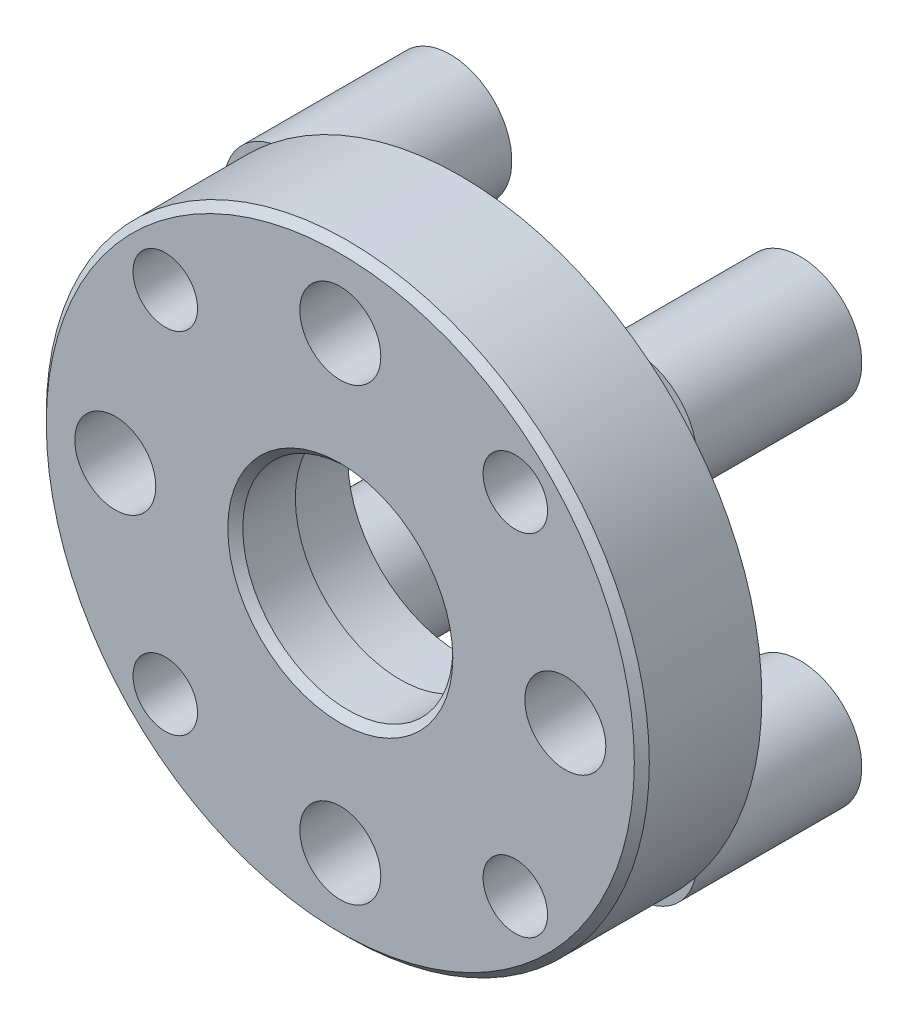
ISO-10303-21;
HEADER;
FILE_DESCRIPTION(('STEP AP214'),'2;1');
FILE_NAME('part.step','',(''),(''),'','','');
FILE_SCHEMA(('AUTOMOTIVE_DESIGN { 1 0 10303 214 1 1 1 1 }'));
ENDSEC;
DATA;
#1=APPLICATION_CONTEXT('core data for automotive mechanical design processes');
#2=APPLICATION_PROTOCOL_DEFINITION('international standard','automotive_design',2000,#1);
#3=PRODUCT_CONTEXT('',#1,'mechanical');
#4=PRODUCT('Part','Part','',(#3));
#5=PRODUCT_RELATED_PRODUCT_CATEGORY('part','',(#4));
#6=PRODUCT_DEFINITION_FORMATION('','',#4);
#7=PRODUCT_DEFINITION_CONTEXT('part definition',#1,'design');
#8=PRODUCT_DEFINITION('design','',#6,#7);
#9=PRODUCT_DEFINITION_SHAPE('','',#8);
#10=(LENGTH_UNIT() NAMED_UNIT(*) SI_UNIT(.MILLI.,.METRE.));
#11=(NAMED_UNIT(*) PLANE_ANGLE_UNIT() SI_UNIT($,.RADIAN.));
#12=(NAMED_UNIT(*) SI_UNIT($,.STERADIAN.) SOLID_ANGLE_UNIT());
#13=UNCERTAINTY_MEASURE_WITH_UNIT(LENGTH_MEASURE(1.E-05),#10,'distance_accuracy_value','');
#14=(GEOMETRIC_REPRESENTATION_CONTEXT(3) GLOBAL_UNCERTAINTY_ASSIGNED_CONTEXT((#13)) GLOBAL_UNIT_ASSIGNED_CONTEXT((#10,
#11,#12)) REPRESENTATION_CONTEXT('',''));
#15=CARTESIAN_POINT('',(0.,0.,0.));
#16=DIRECTION('',(0.,0.,1.));
#17=DIRECTION('',(1.,0.,0.));
#18=AXIS2_PLACEMENT_3D('',#15,#16,#17);
#19=CARTESIAN_POINT('',(0.,0.,33.2347367900408));
#20=DIRECTION('',(0.,0.,-1.));
#21=DIRECTION('',(-1.,0.,0.));
#22=AXIS2_PLACEMENT_3D('',#19,#20,#21);
#23=CYLINDRICAL_SURFACE('',#22,7.5);
#24=CARTESIAN_POINT('',(0.,0.,25.2347367900408));
#25=DIRECTION('',(0.,0.,1.));
#26=DIRECTION('',(1.,0.,0.));
#27=AXIS2_PLACEMENT_3D('',#24,#25,#26);
#28=CIRCLE('',#27,7.5);
#29=CARTESIAN_POINT('',(7.5,0.,25.2347367900408));
#30=VERTEX_POINT('',#29);
#31=EDGE_CURVE('E134',#30,#30,#28,.T.);
#32=ORIENTED_EDGE('',*,*,#31,.F.);
#33=EDGE_LOOP('',(#32));
#34=FACE_BOUND('',#33,.T.);
#35=CARTESIAN_POINT('',(0.,0.,29.2347367900408));
#36=DIRECTION('',(0.,0.,1.));
#37=DIRECTION('',(1.,0.,0.));
#38=AXIS2_PLACEMENT_3D('',#35,#36,#37);
#39=CIRCLE('',#38,7.5);
#40=CARTESIAN_POINT('',(7.5,0.,29.2347367900408));
#41=VERTEX_POINT('',#40);
#42=EDGE_CURVE('E346',#41,#41,#39,.T.);
#43=ORIENTED_EDGE('',*,*,#42,.T.);
#44=EDGE_LOOP('',(#43));
#45=FACE_BOUND('',#44,.T.);
#46=ADVANCED_FACE('F60',(#34,#45),#23,.F.);
#47=CARTESIAN_POINT('',(11.667261889578,-11.667261889578,14.2347367900408));
#48=DIRECTION('',(0.,0.,1.));
#49=DIRECTION('',(1.,0.,0.));
#50=AXIS2_PLACEMENT_3D('',#47,#48,#49);
#51=CYLINDRICAL_SURFACE('',#50,1.6);
#52=CARTESIAN_POINT('',(11.667261889578,-11.667261889578,17.2347367900408));
#53=DIRECTION('',(0.,0.,-1.));
#54=DIRECTION('',(-1.,0.,0.));
#55=AXIS2_PLACEMENT_3D('',#52,#53,#54);
#56=CIRCLE('',#55,1.6);
#57=CARTESIAN_POINT('',(10.067261889578,-11.667261889578,17.2347367900408));
#58=VERTEX_POINT('',#57);
#59=EDGE_CURVE('E137',#58,#58,#56,.F.);
#60=ORIENTED_EDGE('',*,*,#59,.F.);
#61=EDGE_LOOP('',(#60));
#62=FACE_BOUND('',#61,.T.);
#63=CARTESIAN_POINT('',(11.667261889578,-11.667261889578,25.2347367900408));
#64=DIRECTION('',(0.,0.,1.));
#65=DIRECTION('',(1.,0.,0.));
#66=AXIS2_PLACEMENT_3D('',#63,#64,#65);
#67=CIRCLE('',#66,1.6);
#68=CARTESIAN_POINT('',(13.267261889578,-11.667261889578,25.2347367900408));
#69=VERTEX_POINT('',#68);
#70=EDGE_CURVE('E119',#69,#69,#67,.F.);
#71=ORIENTED_EDGE('',*,*,#70,.F.);
#72=EDGE_LOOP('',(#71));
#73=FACE_BOUND('',#72,.T.);
#74=ADVANCED_FACE('F227',(#62,#73),#51,.F.);
#75=CARTESIAN_POINT('',(-11.667261889578,-11.667261889578,14.2347367900408));
#76=DIRECTION('',(0.,0.,1.));
#77=DIRECTION('',(1.,0.,0.));
#78=AXIS2_PLACEMENT_3D('',#75,#76,#77);
#79=CYLINDRICAL_SURFACE('',#78,1.6);
#80=CARTESIAN_POINT('',(-11.667261889578,-11.667261889578,17.2347367900408));
#81=DIRECTION('',(0.,0.,-1.));
#82=DIRECTION('',(-1.,0.,0.));
#83=AXIS2_PLACEMENT_3D('',#80,#81,#82);
#84=CIRCLE('',#83,1.6);
#85=CARTESIAN_POINT('',(-13.267261889578,-11.667261889578,17.2347367900408));
#86=VERTEX_POINT('',#85);
#87=EDGE_CURVE('E481',#86,#86,#84,.F.);
#88=ORIENTED_EDGE('',*,*,#87,.F.);
#89=EDGE_LOOP('',(#88));
#90=FACE_BOUND('',#89,.T.);
#91=CARTESIAN_POINT('',(-11.667261889578,-11.667261889578,25.2347367900408));
#92=DIRECTION('',(0.,0.,1.));
#93=DIRECTION('',(1.,0.,0.));
#94=AXIS2_PLACEMENT_3D('',#91,#92,#93);
#95=CIRCLE('',#94,1.6);
#96=CARTESIAN_POINT('',(-10.067261889578,-11.667261889578,25.2347367900408));
#97=VERTEX_POINT('',#96);
#98=EDGE_CURVE('E468',#97,#97,#95,.F.);
#99=ORIENTED_EDGE('',*,*,#98,.F.);
#100=EDGE_LOOP('',(#99));
#101=FACE_BOUND('',#100,.T.);
#102=ADVANCED_FACE('F235',(#90,#101),#79,.F.);
#103=CARTESIAN_POINT('',(-11.667261889578,11.667261889578,14.2347367900408));
#104=DIRECTION('',(0.,0.,1.));
#105=DIRECTION('',(1.,0.,0.));
#106=AXIS2_PLACEMENT_3D('',#103,#104,#105);
#107=CYLINDRICAL_SURFACE('',#106,1.6);
#108=CARTESIAN_POINT('',(-11.667261889578,11.667261889578,17.2347367900408));
#109=DIRECTION('',(0.,0.,-1.));
#110=DIRECTION('',(-1.,0.,0.));
#111=AXIS2_PLACEMENT_3D('',#108,#109,#110);
#112=CIRCLE('',#111,1.6);
#113=CARTESIAN_POINT('',(-13.267261889578,11.667261889578,17.2347367900408));
#114=VERTEX_POINT('',#113);
#115=EDGE_CURVE('E484',#114,#114,#112,.F.);
#116=ORIENTED_EDGE('',*,*,#115,.F.);
#117=EDGE_LOOP('',(#116));
#118=FACE_BOUND('',#117,.T.);
#119=CARTESIAN_POINT('',(-11.667261889578,11.667261889578,25.2347367900408));
#120=DIRECTION('',(0.,0.,1.));
#121=DIRECTION('',(1.,0.,0.));
#122=AXIS2_PLACEMENT_3D('',#119,#120,#121);
#123=CIRCLE('',#122,1.6);
#124=CARTESIAN_POINT('',(-10.067261889578,11.667261889578,25.2347367900408));
#125=VERTEX_POINT('',#124);
#126=EDGE_CURVE('E465',#125,#125,#123,.F.);
#127=ORIENTED_EDGE('',*,*,#126,.F.);
#128=EDGE_LOOP('',(#127));
#129=FACE_BOUND('',#128,.T.);
#130=ADVANCED_FACE('F451',(#118,#129),#107,.F.);
#131=CARTESIAN_POINT('',(11.667261889578,11.667261889578,14.2347367900408));
#132=DIRECTION('',(0.,0.,1.));
#133=DIRECTION('',(1.,0.,0.));
#134=AXIS2_PLACEMENT_3D('',#131,#132,#133);
#135=CYLINDRICAL_SURFACE('',#134,1.6);
#136=CARTESIAN_POINT('',(11.667261889578,11.667261889578,17.2347367900408));
#137=DIRECTION('',(0.,0.,-1.));
#138=DIRECTION('',(-1.,0.,0.));
#139=AXIS2_PLACEMENT_3D('',#136,#137,#138);
#140=CIRCLE('',#139,1.6);
#141=CARTESIAN_POINT('',(10.067261889578,11.667261889578,17.2347367900408));
#142=VERTEX_POINT('',#141);
#143=EDGE_CURVE('E185',#142,#142,#140,.F.);
#144=ORIENTED_EDGE('',*,*,#143,.F.);
#145=EDGE_LOOP('',(#144));
#146=FACE_BOUND('',#145,.T.);
#147=CARTESIAN_POINT('',(11.667261889578,11.667261889578,25.2347367900408));
#148=DIRECTION('',(0.,0.,1.));
#149=DIRECTION('',(1.,0.,0.));
#150=AXIS2_PLACEMENT_3D('',#147,#148,#149);
#151=CIRCLE('',#150,1.6);
#152=CARTESIAN_POINT('',(13.267261889578,11.667261889578,25.2347367900408));
#153=VERTEX_POINT('',#152);
#154=EDGE_CURVE('E317',#153,#153,#151,.F.);
#155=ORIENTED_EDGE('',*,*,#154,.F.);
#156=EDGE_LOOP('',(#155));
#157=FACE_BOUND('',#156,.T.);
#158=ADVANCED_FACE('F194',(#146,#157),#135,.F.);
#159=CARTESIAN_POINT('',(11.667261889578,11.667261889578,14.2347367900408));
#160=DIRECTION('',(0.,0.,-1.));
#161=DIRECTION('',(-1.,0.,0.));
#162=AXIS2_PLACEMENT_3D('',#159,#160,#161);
#163=PLANE('',#162);
#164=CARTESIAN_POINT('',(11.667261889578,11.667261889578,14.2347367900408));
#165=DIRECTION('',(0.,0.,-1.));
#166=DIRECTION('',(-1.,0.,0.));
#167=AXIS2_PLACEMENT_3D('',#164,#165,#166);
#168=CIRCLE('',#167,3.);
#169=CARTESIAN_POINT('',(8.66726188957803,11.667261889578,14.2347367900408));
#170=VERTEX_POINT('',#169);
#171=EDGE_CURVE('E167',#170,#170,#168,.T.);
#172=ORIENTED_EDGE('',*,*,#171,.F.);
#173=EDGE_LOOP('',(#172));
#174=FACE_BOUND('',#173,.T.);
#175=CARTESIAN_POINT('',(11.667261889578,11.667261889578,14.2347367900408));
#176=DIRECTION('',(0.,0.,-1.));
#177=DIRECTION('',(-1.,0.,0.));
#178=AXIS2_PLACEMENT_3D('',#175,#176,#177);
#179=CIRCLE('',#178,4.1);
#180=CARTESIAN_POINT('',(7.56726188957803,11.667261889578,14.2347367900408));
#181=VERTEX_POINT('',#180);
#182=EDGE_CURVE('E122',#181,#181,#179,.T.);
#183=ORIENTED_EDGE('',*,*,#182,.T.);
#184=EDGE_LOOP('',(#183));
#185=FACE_BOUND('',#184,.T.);
#186=ADVANCED_FACE('F191',(#174,#185),#163,.T.);
#187=CARTESIAN_POINT('',(11.667261889578,11.667261889578,25.2347367900408));
#188=DIRECTION('',(0.,0.,-1.));
#189=DIRECTION('',(-1.,0.,0.));
#190=AXIS2_PLACEMENT_3D('',#187,#188,#189);
#191=PLANE('',#190);
#192=CARTESIAN_POINT('',(0.,0.,25.2347367900408));
#193=DIRECTION('',(0.,0.,1.));
#194=DIRECTION('',(1.,0.,0.));
#195=AXIS2_PLACEMENT_3D('',#192,#193,#194);
#196=CIRCLE('',#195,20.1);
#197=CARTESIAN_POINT('',(15.6594660866061,12.6012349348163,25.2347367900408));
#198=VERTEX_POINT('',#197);
#199=CARTESIAN_POINT('',(12.6012349348163,15.6594660866061,25.2347367900408));
#200=VERTEX_POINT('',#199);
#201=EDGE_CURVE('E99',#198,#200,#196,.T.);
#202=ORIENTED_EDGE('',*,*,#201,.F.);
#203=CARTESIAN_POINT('',(11.667261889578,11.667261889578,25.2347367900408));
#204=DIRECTION('',(0.,0.,-1.));
#205=DIRECTION('',(-1.,0.,0.));
#206=AXIS2_PLACEMENT_3D('',#203,#204,#205);
#207=CIRCLE('',#206,4.1);
#208=EDGE_CURVE('E117',#200,#198,#207,.T.);
#209=ORIENTED_EDGE('',*,*,#208,.F.);
#210=EDGE_LOOP('',(#202,#209));
#211=FACE_BOUND('',#210,.T.);
#212=ADVANCED_FACE('F121',(#211),#191,.F.);
#213=CARTESIAN_POINT('',(0.,0.,33.2347367900408));
#214=DIRECTION('',(0.,0.,1.));
#215=DIRECTION('',(1.,0.,0.));
#216=AXIS2_PLACEMENT_3D('',#213,#214,#215);
#217=PLANE('',#216);
#218=CARTESIAN_POINT('',(0.,0.,33.2347367900408));
#219=DIRECTION('',(0.,0.,1.));
#220=DIRECTION('',(1.,0.,0.));
#221=AXIS2_PLACEMENT_3D('',#218,#219,#220);
#222=CIRCLE('',#221,7.49999999999997);
#223=CARTESIAN_POINT('',(7.49999999999997,0.,33.2347367900408));
#224=VERTEX_POINT('',#223);
#225=EDGE_CURVE('E69',#224,#224,#222,.F.);
#226=ORIENTED_EDGE('',*,*,#225,.T.);
#227=EDGE_LOOP('',(#226));
#228=FACE_BOUND('',#227,.T.);
#229=CARTESIAN_POINT('',(0.,0.,33.2347367900408));
#230=DIRECTION('',(0.,0.,1.));
#231=DIRECTION('',(1.,0.,0.));
#232=AXIS2_PLACEMENT_3D('',#229,#230,#231);
#233=CIRCLE('',#232,19.6);
#234=CARTESIAN_POINT('',(19.6,0.,33.2347367900408));
#235=VERTEX_POINT('',#234);
#236=EDGE_CURVE('E275',#235,#235,#233,.T.);
#237=ORIENTED_EDGE('',*,*,#236,.T.);
#238=EDGE_LOOP('',(#237));
#239=FACE_BOUND('',#238,.T.);
#240=CARTESIAN_POINT('',(15.,0.,33.2347367900408));
#241=DIRECTION('',(0.,0.,1.));
#242=DIRECTION('',(1.,0.,0.));
#243=AXIS2_PLACEMENT_3D('',#240,#241,#242);
#244=CIRCLE('',#243,2.7);
#245=CARTESIAN_POINT('',(17.7,0.,33.2347367900408));
#246=VERTEX_POINT('',#245);
#247=EDGE_CURVE('E287',#246,#246,#244,.T.);
#248=ORIENTED_EDGE('',*,*,#247,.F.);
#249=EDGE_LOOP('',(#248));
#250=FACE_BOUND('',#249,.T.);
#251=CARTESIAN_POINT('',(-1.04744440165294E-13,-15.,33.2347367900408));
#252=DIRECTION('',(0.,0.,1.));
#253=DIRECTION('',(1.,0.,0.));
#254=AXIS2_PLACEMENT_3D('',#251,#252,#253);
#255=CIRCLE('',#254,2.7);
#256=CARTESIAN_POINT('',(2.6999999999999,-15.,33.2347367900408));
#257=VERTEX_POINT('',#256);
#258=EDGE_CURVE('E291',#257,#257,#255,.T.);
#259=ORIENTED_EDGE('',*,*,#258,.F.);
#260=EDGE_LOOP('',(#259));
#261=FACE_BOUND('',#260,.T.);
#262=CARTESIAN_POINT('',(-15.,1.57116660247941E-13,33.2347367900408));
#263=DIRECTION('',(0.,0.,1.));
#264=DIRECTION('',(1.,0.,0.));
#265=AXIS2_PLACEMENT_3D('',#262,#263,#264);
#266=CIRCLE('',#265,2.7);
#267=CARTESIAN_POINT('',(-12.3,1.57116660247941E-13,33.2347367900408));
#268=VERTEX_POINT('',#267);
#269=EDGE_CURVE('E295',#268,#268,#266,.T.);
#270=ORIENTED_EDGE('',*,*,#269,.F.);
#271=EDGE_LOOP('',(#270));
#272=FACE_BOUND('',#271,.T.);
#273=CARTESIAN_POINT('',(-11.667261889578,11.667261889578,33.2347367900408));
#274=DIRECTION('',(0.,0.,1.));
#275=DIRECTION('',(1.,0.,0.));
#276=AXIS2_PLACEMENT_3D('',#273,#274,#275);
#277=CIRCLE('',#276,2.15);
#278=CARTESIAN_POINT('',(-9.51726188957804,11.667261889578,33.2347367900408));
#279=VERTEX_POINT('',#278);
#280=EDGE_CURVE('E299',#279,#279,#277,.T.);
#281=ORIENTED_EDGE('',*,*,#280,.F.);
#282=EDGE_LOOP('',(#281));
#283=FACE_BOUND('',#282,.T.);
#284=CARTESIAN_POINT('',(11.667261889578,11.667261889578,33.2347367900408));
#285=DIRECTION('',(0.,0.,1.));
#286=DIRECTION('',(1.,0.,0.));
#287=AXIS2_PLACEMENT_3D('',#284,#285,#286);
#288=CIRCLE('',#287,2.15);
#289=CARTESIAN_POINT('',(13.817261889578,11.667261889578,33.2347367900408));
#290=VERTEX_POINT('',#289);
#291=EDGE_CURVE('E303',#290,#290,#288,.T.);
#292=ORIENTED_EDGE('',*,*,#291,.F.);
#293=EDGE_LOOP('',(#292));
#294=FACE_BOUND('',#293,.T.);
#295=CARTESIAN_POINT('',(11.667261889578,-11.667261889578,33.2347367900408));
#296=DIRECTION('',(0.,0.,1.));
#297=DIRECTION('',(1.,0.,0.));
#298=AXIS2_PLACEMENT_3D('',#295,#296,#297);
#299=CIRCLE('',#298,2.15);
#300=CARTESIAN_POINT('',(13.817261889578,-11.667261889578,33.2347367900408));
#301=VERTEX_POINT('',#300);
#302=EDGE_CURVE('E307',#301,#301,#299,.T.);
#303=ORIENTED_EDGE('',*,*,#302,.F.);
#304=EDGE_LOOP('',(#303));
#305=FACE_BOUND('',#304,.T.);
#306=CARTESIAN_POINT('',(-11.667261889578,-11.667261889578,33.2347367900408));
#307=DIRECTION('',(0.,0.,1.));
#308=DIRECTION('',(1.,0.,0.));
#309=AXIS2_PLACEMENT_3D('',#306,#307,#308);
#310=CIRCLE('',#309,2.15);
#311=CARTESIAN_POINT('',(-9.51726188957803,-11.667261889578,33.2347367900408));
#312=VERTEX_POINT('',#311);
#313=EDGE_CURVE('E311',#312,#312,#310,.T.);
#314=ORIENTED_EDGE('',*,*,#313,.F.);
#315=EDGE_LOOP('',(#314));
#316=FACE_BOUND('',#315,.T.);
#317=CARTESIAN_POINT('',(0.,15.,33.2347367900408));
#318=DIRECTION('',(0.,0.,1.));
#319=DIRECTION('',(1.,0.,0.));
#320=AXIS2_PLACEMENT_3D('',#317,#318,#319);
#321=CIRCLE('',#320,2.7);
#322=CARTESIAN_POINT('',(2.7,15.,33.2347367900408));
#323=VERTEX_POINT('',#322);
#324=EDGE_CURVE('E203',#323,#323,#321,.T.);
#325=ORIENTED_EDGE('',*,*,#324,.F.);
#326=EDGE_LOOP('',(#325));
#327=FACE_BOUND('',#326,.T.);
#328=ADVANCED_FACE('F244',(#228,#239,#250,#261,#272,#283,#294,#305,#316,#327),#217,.T.);
#329=CARTESIAN_POINT('',(0.,0.,25.2347367900408));
#330=DIRECTION('',(0.,0.,1.));
#331=DIRECTION('',(1.,0.,0.));
#332=AXIS2_PLACEMENT_3D('',#329,#330,#331);
#333=PLANE('',#332);
#334=CARTESIAN_POINT('',(15.,0.,25.2347367900408));
#335=DIRECTION('',(0.,0.,1.));
#336=DIRECTION('',(1.,0.,0.));
#337=AXIS2_PLACEMENT_3D('',#334,#335,#336);
#338=CIRCLE('',#337,2.7);
#339=CARTESIAN_POINT('',(17.7,0.,25.2347367900408));
#340=VERTEX_POINT('',#339);
#341=EDGE_CURVE('E318',#340,#340,#338,.T.);
#342=ORIENTED_EDGE('',*,*,#341,.T.);
#343=EDGE_LOOP('',(#342));
#344=FACE_BOUND('',#343,.T.);
#345=CARTESIAN_POINT('',(-1.04744440165294E-13,-15.,25.2347367900408));
#346=DIRECTION('',(0.,0.,1.));
#347=DIRECTION('',(1.,0.,0.));
#348=AXIS2_PLACEMENT_3D('',#345,#346,#347);
#349=CIRCLE('',#348,2.7);
#350=CARTESIAN_POINT('',(2.6999999999999,-15.,25.2347367900408));
#351=VERTEX_POINT('',#350);
#352=EDGE_CURVE('E328',#351,#351,#349,.T.);
#353=ORIENTED_EDGE('',*,*,#352,.T.);
#354=EDGE_LOOP('',(#353));
#355=FACE_BOUND('',#354,.T.);
#356=CARTESIAN_POINT('',(-15.,1.57116660247941E-13,25.2347367900408));
#357=DIRECTION('',(0.,0.,1.));
#358=DIRECTION('',(1.,0.,0.));
#359=AXIS2_PLACEMENT_3D('',#356,#357,#358);
#360=CIRCLE('',#359,2.7);
#361=CARTESIAN_POINT('',(-12.3,1.57116660247941E-13,25.2347367900408));
#362=VERTEX_POINT('',#361);
#363=EDGE_CURVE('E332',#362,#362,#360,.T.);
#364=ORIENTED_EDGE('',*,*,#363,.T.);
#365=EDGE_LOOP('',(#364));
#366=FACE_BOUND('',#365,.T.);
#367=CARTESIAN_POINT('',(0.,15.,25.2347367900408));
#368=DIRECTION('',(0.,0.,1.));
#369=DIRECTION('',(1.,0.,0.));
#370=AXIS2_PLACEMENT_3D('',#367,#368,#369);
#371=CIRCLE('',#370,2.7);
#372=CARTESIAN_POINT('',(2.7,15.,25.2347367900408));
#373=VERTEX_POINT('',#372);
#374=EDGE_CURVE('E315',#373,#373,#371,.T.);
#375=ORIENTED_EDGE('',*,*,#374,.T.);
#376=EDGE_LOOP('',(#375));
#377=FACE_BOUND('',#376,.T.);
#378=CARTESIAN_POINT('',(-12.6012349348163,15.6594660866061,25.2347367900408));
#379=VERTEX_POINT('',#378);
#380=EDGE_CURVE('E103',#200,#379,#196,.T.);
#381=ORIENTED_EDGE('',*,*,#380,.F.);
#382=EDGE_CURVE('E114',#198,#200,#207,.T.);
#383=ORIENTED_EDGE('',*,*,#382,.F.);
#384=CARTESIAN_POINT('',(15.6594660866061,-12.6012349348163,25.2347367900408));
#385=VERTEX_POINT('',#384);
#386=EDGE_CURVE('E105',#385,#198,#196,.T.);
#387=ORIENTED_EDGE('',*,*,#386,.F.);
#388=CARTESIAN_POINT('',(11.667261889578,-11.667261889578,25.2347367900408));
#389=DIRECTION('',(0.,0.,-1.));
#390=DIRECTION('',(-1.,0.,0.));
#391=AXIS2_PLACEMENT_3D('',#388,#389,#390);
#392=CIRCLE('',#391,4.1);
#393=CARTESIAN_POINT('',(12.6012349348163,-15.6594660866061,25.2347367900408));
#394=VERTEX_POINT('',#393);
#395=EDGE_CURVE('E198',#394,#385,#392,.T.);
#396=ORIENTED_EDGE('',*,*,#395,.F.);
#397=CARTESIAN_POINT('',(-12.6012349348162,-15.6594660866061,25.2347367900408));
#398=VERTEX_POINT('',#397);
#399=EDGE_CURVE('E135',#398,#394,#196,.T.);
#400=ORIENTED_EDGE('',*,*,#399,.F.);
#401=CARTESIAN_POINT('',(-11.667261889578,-11.667261889578,25.2347367900408));
#402=DIRECTION('',(0.,0.,-1.));
#403=DIRECTION('',(-1.,0.,0.));
#404=AXIS2_PLACEMENT_3D('',#401,#402,#403);
#405=CIRCLE('',#404,4.1);
#406=CARTESIAN_POINT('',(-15.6594660866061,-12.6012349348163,25.2347367900408));
#407=VERTEX_POINT('',#406);
#408=EDGE_CURVE('E149',#407,#398,#405,.T.);
#409=ORIENTED_EDGE('',*,*,#408,.F.);
#410=CARTESIAN_POINT('',(-15.6594660866061,12.6012349348162,25.2347367900408));
#411=VERTEX_POINT('',#410);
#412=EDGE_CURVE('E130',#411,#407,#196,.T.);
#413=ORIENTED_EDGE('',*,*,#412,.F.);
#414=CARTESIAN_POINT('',(-11.667261889578,11.667261889578,25.2347367900408));
#415=DIRECTION('',(0.,0.,-1.));
#416=DIRECTION('',(-1.,0.,0.));
#417=AXIS2_PLACEMENT_3D('',#414,#415,#416);
#418=CIRCLE('',#417,4.1);
#419=EDGE_CURVE('E128',#379,#411,#418,.T.);
#420=ORIENTED_EDGE('',*,*,#419,.F.);
#421=EDGE_LOOP('',(#381,#383,#387,#396,#400,#409,#413,#420));
#422=FACE_BOUND('',#421,.T.);
#423=ORIENTED_EDGE('',*,*,#31,.T.);
#424=EDGE_LOOP('',(#423));
#425=FACE_BOUND('',#424,.T.);
#426=ADVANCED_FACE('F124',(#344,#355,#366,#377,#422,#425),#333,.F.);
#427=CARTESIAN_POINT('',(0.,0.,33.2347367900408));
#428=DIRECTION('',(0.,0.,-1.));
#429=DIRECTION('',(-1.,0.,0.));
#430=AXIS2_PLACEMENT_3D('',#427,#428,#429);
#431=CYLINDRICAL_SURFACE('',#430,20.1);
#432=CARTESIAN_POINT('',(0.,0.,32.7347367900408));
#433=DIRECTION('',(0.,0.,1.));
#434=DIRECTION('',(1.,0.,0.));
#435=AXIS2_PLACEMENT_3D('',#432,#433,#434);
#436=CIRCLE('',#435,20.1);
#437=CARTESIAN_POINT('',(20.1,0.,32.7347367900408));
#438=VERTEX_POINT('',#437);
#439=EDGE_CURVE('E12',#438,#438,#436,.F.);
#440=ORIENTED_EDGE('',*,*,#439,.T.);
#441=EDGE_LOOP('',(#440));
#442=FACE_BOUND('',#441,.T.);
#443=ORIENTED_EDGE('',*,*,#201,.T.);
#444=ORIENTED_EDGE('',*,*,#380,.T.);
#445=EDGE_CURVE('E111',#379,#411,#196,.T.);
#446=ORIENTED_EDGE('',*,*,#445,.T.);
#447=ORIENTED_EDGE('',*,*,#412,.T.);
#448=EDGE_CURVE('E131',#407,#398,#196,.T.);
#449=ORIENTED_EDGE('',*,*,#448,.T.);
#450=ORIENTED_EDGE('',*,*,#399,.T.);
#451=EDGE_CURVE('E76',#394,#385,#196,.T.);
#452=ORIENTED_EDGE('',*,*,#451,.T.);
#453=ORIENTED_EDGE('',*,*,#386,.T.);
#454=EDGE_LOOP('',(#443,#444,#446,#447,#449,#450,#452,#453));
#455=FACE_BOUND('',#454,.T.);
#456=ADVANCED_FACE('F101',(#442,#455),#431,.T.);
#457=CARTESIAN_POINT('',(-11.667261889578,11.667261889578,14.2347367900408));
#458=DIRECTION('',(0.,0.,-1.));
#459=DIRECTION('',(-1.,0.,0.));
#460=AXIS2_PLACEMENT_3D('',#457,#458,#459);
#461=PLANE('',#460);
#462=CARTESIAN_POINT('',(-11.667261889578,11.667261889578,14.2347367900408));
#463=DIRECTION('',(0.,0.,-1.));
#464=DIRECTION('',(-1.,0.,0.));
#465=AXIS2_PLACEMENT_3D('',#462,#463,#464);
#466=CIRCLE('',#465,3.);
#467=CARTESIAN_POINT('',(-14.667261889578,11.667261889578,14.2347367900408));
#468=VERTEX_POINT('',#467);
#469=EDGE_CURVE('E177',#468,#468,#466,.T.);
#470=ORIENTED_EDGE('',*,*,#469,.F.);
#471=EDGE_LOOP('',(#470));
#472=FACE_BOUND('',#471,.T.);
#473=CARTESIAN_POINT('',(-11.667261889578,11.667261889578,14.2347367900408));
#474=DIRECTION('',(0.,0.,-1.));
#475=DIRECTION('',(-1.,0.,0.));
#476=AXIS2_PLACEMENT_3D('',#473,#474,#475);
#477=CIRCLE('',#476,4.1);
#478=CARTESIAN_POINT('',(-15.767261889578,11.667261889578,14.2347367900408));
#479=VERTEX_POINT('',#478);
#480=EDGE_CURVE('E154',#479,#479,#477,.T.);
#481=ORIENTED_EDGE('',*,*,#480,.T.);
#482=EDGE_LOOP('',(#481));
#483=FACE_BOUND('',#482,.T.);
#484=ADVANCED_FACE('F242',(#472,#483),#461,.T.);
#485=CARTESIAN_POINT('',(-11.667261889578,11.667261889578,25.2347367900408));
#486=DIRECTION('',(0.,0.,-1.));
#487=DIRECTION('',(-1.,0.,0.));
#488=AXIS2_PLACEMENT_3D('',#485,#486,#487);
#489=PLANE('',#488);
#490=ORIENTED_EDGE('',*,*,#445,.F.);
#491=EDGE_CURVE('E159',#411,#379,#418,.T.);
#492=ORIENTED_EDGE('',*,*,#491,.F.);
#493=EDGE_LOOP('',(#490,#492));
#494=FACE_BOUND('',#493,.T.);
#495=ADVANCED_FACE('F684',(#494),#489,.F.);
#496=CARTESIAN_POINT('',(-11.667261889578,-11.667261889578,14.2347367900408));
#497=DIRECTION('',(0.,0.,-1.));
#498=DIRECTION('',(-1.,0.,0.));
#499=AXIS2_PLACEMENT_3D('',#496,#497,#498);
#500=PLANE('',#499);
#501=CARTESIAN_POINT('',(-11.667261889578,-11.667261889578,14.2347367900408));
#502=DIRECTION('',(0.,0.,-1.));
#503=DIRECTION('',(-1.,0.,0.));
#504=AXIS2_PLACEMENT_3D('',#501,#502,#503);
#505=CIRCLE('',#504,3.);
#506=CARTESIAN_POINT('',(-14.667261889578,-11.667261889578,14.2347367900408));
#507=VERTEX_POINT('',#506);
#508=EDGE_CURVE('E171',#507,#507,#505,.T.);
#509=ORIENTED_EDGE('',*,*,#508,.F.);
#510=EDGE_LOOP('',(#509));
#511=FACE_BOUND('',#510,.T.);
#512=CARTESIAN_POINT('',(-11.667261889578,-11.667261889578,14.2347367900408));
#513=DIRECTION('',(0.,0.,-1.));
#514=DIRECTION('',(-1.,0.,0.));
#515=AXIS2_PLACEMENT_3D('',#512,#513,#514);
#516=CIRCLE('',#515,4.1);
#517=CARTESIAN_POINT('',(-15.767261889578,-11.667261889578,14.2347367900408));
#518=VERTEX_POINT('',#517);
#519=EDGE_CURVE('E151',#518,#518,#516,.T.);
#520=ORIENTED_EDGE('',*,*,#519,.T.);
#521=EDGE_LOOP('',(#520));
#522=FACE_BOUND('',#521,.T.);
#523=ADVANCED_FACE('F693',(#511,#522),#500,.T.);
#524=CARTESIAN_POINT('',(-11.667261889578,-11.667261889578,25.2347367900408));
#525=DIRECTION('',(0.,0.,-1.));
#526=DIRECTION('',(-1.,0.,0.));
#527=AXIS2_PLACEMENT_3D('',#524,#525,#526);
#528=PLANE('',#527);
#529=ORIENTED_EDGE('',*,*,#448,.F.);
#530=EDGE_CURVE('E146',#398,#407,#405,.T.);
#531=ORIENTED_EDGE('',*,*,#530,.F.);
#532=EDGE_LOOP('',(#529,#531));
#533=FACE_BOUND('',#532,.T.);
#534=ADVANCED_FACE('F222',(#533),#528,.F.);
#535=CARTESIAN_POINT('',(11.667261889578,-11.667261889578,14.2347367900408));
#536=DIRECTION('',(0.,0.,-1.));
#537=DIRECTION('',(-1.,0.,0.));
#538=AXIS2_PLACEMENT_3D('',#535,#536,#537);
#539=PLANE('',#538);
#540=CARTESIAN_POINT('',(11.667261889578,-11.667261889578,14.2347367900408));
#541=DIRECTION('',(0.,0.,-1.));
#542=DIRECTION('',(-1.,0.,0.));
#543=AXIS2_PLACEMENT_3D('',#540,#541,#542);
#544=CIRCLE('',#543,3.);
#545=CARTESIAN_POINT('',(8.66726188957804,-11.667261889578,14.2347367900408));
#546=VERTEX_POINT('',#545);
#547=EDGE_CURVE('E164',#546,#546,#544,.T.);
#548=ORIENTED_EDGE('',*,*,#547,.F.);
#549=EDGE_LOOP('',(#548));
#550=FACE_BOUND('',#549,.T.);
#551=CARTESIAN_POINT('',(11.667261889578,-11.667261889578,14.2347367900408));
#552=DIRECTION('',(0.,0.,-1.));
#553=DIRECTION('',(-1.,0.,0.));
#554=AXIS2_PLACEMENT_3D('',#551,#552,#553);
#555=CIRCLE('',#554,4.1);
#556=CARTESIAN_POINT('',(7.56726188957804,-11.667261889578,14.2347367900408));
#557=VERTEX_POINT('',#556);
#558=EDGE_CURVE('E156',#557,#557,#555,.T.);
#559=ORIENTED_EDGE('',*,*,#558,.T.);
#560=EDGE_LOOP('',(#559));
#561=FACE_BOUND('',#560,.T.);
#562=ADVANCED_FACE('F213',(#550,#561),#539,.T.);
#563=CARTESIAN_POINT('',(11.667261889578,-11.667261889578,25.2347367900408));
#564=DIRECTION('',(0.,0.,-1.));
#565=DIRECTION('',(-1.,0.,0.));
#566=AXIS2_PLACEMENT_3D('',#563,#564,#565);
#567=PLANE('',#566);
#568=ORIENTED_EDGE('',*,*,#451,.F.);
#569=EDGE_CURVE('E201',#385,#394,#392,.T.);
#570=ORIENTED_EDGE('',*,*,#569,.F.);
#571=EDGE_LOOP('',(#568,#570));
#572=FACE_BOUND('',#571,.T.);
#573=ADVANCED_FACE('F210',(#572),#567,.F.);
#574=CARTESIAN_POINT('',(11.667261889578,11.667261889578,17.2347367900408));
#575=DIRECTION('',(0.,0.,-1.));
#576=DIRECTION('',(-1.,0.,0.));
#577=AXIS2_PLACEMENT_3D('',#574,#575,#576);
#578=PLANE('',#577);
#579=CARTESIAN_POINT('',(11.667261889578,11.667261889578,17.2347367900408));
#580=DIRECTION('',(0.,0.,-1.));
#581=DIRECTION('',(-1.,0.,0.));
#582=AXIS2_PLACEMENT_3D('',#579,#580,#581);
#583=CIRCLE('',#582,3.);
#584=CARTESIAN_POINT('',(8.66726188957803,11.667261889578,17.2347367900408));
#585=VERTEX_POINT('',#584);
#586=EDGE_CURVE('E182',#585,#585,#583,.T.);
#587=ORIENTED_EDGE('',*,*,#586,.T.);
#588=EDGE_LOOP('',(#587));
#589=FACE_BOUND('',#588,.T.);
#590=ORIENTED_EDGE('',*,*,#143,.T.);
#591=EDGE_LOOP('',(#590));
#592=FACE_BOUND('',#591,.T.);
#593=ADVANCED_FACE('F212',(#589,#592),#578,.T.);
#594=CARTESIAN_POINT('',(11.667261889578,11.667261889578,17.2347367900408));
#595=DIRECTION('',(0.,0.,-1.));
#596=DIRECTION('',(-1.,0.,0.));
#597=AXIS2_PLACEMENT_3D('',#594,#595,#596);
#598=CYLINDRICAL_SURFACE('',#597,3.);
#599=ORIENTED_EDGE('',*,*,#586,.F.);
#600=EDGE_LOOP('',(#599));
#601=FACE_BOUND('',#600,.T.);
#602=ORIENTED_EDGE('',*,*,#171,.T.);
#603=EDGE_LOOP('',(#602));
#604=FACE_BOUND('',#603,.T.);
#605=ADVANCED_FACE('F189',(#601,#604),#598,.F.);
#606=CARTESIAN_POINT('',(-11.667261889578,11.667261889578,17.2347367900408));
#607=DIRECTION('',(0.,0.,-1.));
#608=DIRECTION('',(-1.,0.,0.));
#609=AXIS2_PLACEMENT_3D('',#606,#607,#608);
#610=PLANE('',#609);
#611=CARTESIAN_POINT('',(-11.667261889578,11.667261889578,17.2347367900408));
#612=DIRECTION('',(0.,0.,-1.));
#613=DIRECTION('',(-1.,0.,0.));
#614=AXIS2_PLACEMENT_3D('',#611,#612,#613);
#615=CIRCLE('',#614,3.);
#616=CARTESIAN_POINT('',(-14.667261889578,11.667261889578,17.2347367900408));
#617=VERTEX_POINT('',#616);
#618=EDGE_CURVE('E161',#617,#617,#615,.T.);
#619=ORIENTED_EDGE('',*,*,#618,.T.);
#620=EDGE_LOOP('',(#619));
#621=FACE_BOUND('',#620,.T.);
#622=ORIENTED_EDGE('',*,*,#115,.T.);
#623=EDGE_LOOP('',(#622));
#624=FACE_BOUND('',#623,.T.);
#625=ADVANCED_FACE('F441',(#621,#624),#610,.T.);
#626=CARTESIAN_POINT('',(-11.667261889578,11.667261889578,17.2347367900408));
#627=DIRECTION('',(0.,0.,-1.));
#628=DIRECTION('',(-1.,0.,0.));
#629=AXIS2_PLACEMENT_3D('',#626,#627,#628);
#630=CYLINDRICAL_SURFACE('',#629,3.);
#631=ORIENTED_EDGE('',*,*,#618,.F.);
#632=EDGE_LOOP('',(#631));
#633=FACE_BOUND('',#632,.T.);
#634=ORIENTED_EDGE('',*,*,#469,.T.);
#635=EDGE_LOOP('',(#634));
#636=FACE_BOUND('',#635,.T.);
#637=ADVANCED_FACE('F437',(#633,#636),#630,.F.);
#638=CARTESIAN_POINT('',(-11.667261889578,-11.667261889578,17.2347367900408));
#639=DIRECTION('',(0.,0.,-1.));
#640=DIRECTION('',(-1.,0.,0.));
#641=AXIS2_PLACEMENT_3D('',#638,#639,#640);
#642=PLANE('',#641);
#643=CARTESIAN_POINT('',(-11.667261889578,-11.667261889578,17.2347367900408));
#644=DIRECTION('',(0.,0.,-1.));
#645=DIRECTION('',(-1.,0.,0.));
#646=AXIS2_PLACEMENT_3D('',#643,#644,#645);
#647=CIRCLE('',#646,3.);
#648=CARTESIAN_POINT('',(-14.667261889578,-11.667261889578,17.2347367900408));
#649=VERTEX_POINT('',#648);
#650=EDGE_CURVE('E174',#649,#649,#647,.T.);
#651=ORIENTED_EDGE('',*,*,#650,.T.);
#652=EDGE_LOOP('',(#651));
#653=FACE_BOUND('',#652,.T.);
#654=ORIENTED_EDGE('',*,*,#87,.T.);
#655=EDGE_LOOP('',(#654));
#656=FACE_BOUND('',#655,.T.);
#657=ADVANCED_FACE('F433',(#653,#656),#642,.T.);
#658=CARTESIAN_POINT('',(-11.667261889578,-11.667261889578,17.2347367900408));
#659=DIRECTION('',(0.,0.,-1.));
#660=DIRECTION('',(-1.,0.,0.));
#661=AXIS2_PLACEMENT_3D('',#658,#659,#660);
#662=CYLINDRICAL_SURFACE('',#661,3.);
#663=ORIENTED_EDGE('',*,*,#650,.F.);
#664=EDGE_LOOP('',(#663));
#665=FACE_BOUND('',#664,.T.);
#666=ORIENTED_EDGE('',*,*,#508,.T.);
#667=EDGE_LOOP('',(#666));
#668=FACE_BOUND('',#667,.T.);
#669=ADVANCED_FACE('F429',(#665,#668),#662,.F.);
#670=CARTESIAN_POINT('',(11.667261889578,-11.667261889578,17.2347367900408));
#671=DIRECTION('',(0.,0.,-1.));
#672=DIRECTION('',(-1.,0.,0.));
#673=AXIS2_PLACEMENT_3D('',#670,#671,#672);
#674=PLANE('',#673);
#675=CARTESIAN_POINT('',(11.667261889578,-11.667261889578,17.2347367900408));
#676=DIRECTION('',(0.,0.,-1.));
#677=DIRECTION('',(-1.,0.,0.));
#678=AXIS2_PLACEMENT_3D('',#675,#676,#677);
#679=CIRCLE('',#678,3.);
#680=CARTESIAN_POINT('',(8.66726188957804,-11.667261889578,17.2347367900408));
#681=VERTEX_POINT('',#680);
#682=EDGE_CURVE('E168',#681,#681,#679,.T.);
#683=ORIENTED_EDGE('',*,*,#682,.T.);
#684=EDGE_LOOP('',(#683));
#685=FACE_BOUND('',#684,.T.);
#686=ORIENTED_EDGE('',*,*,#59,.T.);
#687=EDGE_LOOP('',(#686));
#688=FACE_BOUND('',#687,.T.);
#689=ADVANCED_FACE('F425',(#685,#688),#674,.T.);
#690=CARTESIAN_POINT('',(11.667261889578,-11.667261889578,17.2347367900408));
#691=DIRECTION('',(0.,0.,-1.));
#692=DIRECTION('',(-1.,0.,0.));
#693=AXIS2_PLACEMENT_3D('',#690,#691,#692);
#694=CYLINDRICAL_SURFACE('',#693,3.);
#695=ORIENTED_EDGE('',*,*,#682,.F.);
#696=EDGE_LOOP('',(#695));
#697=FACE_BOUND('',#696,.T.);
#698=ORIENTED_EDGE('',*,*,#547,.T.);
#699=EDGE_LOOP('',(#698));
#700=FACE_BOUND('',#699,.T.);
#701=ADVANCED_FACE('F421',(#697,#700),#694,.F.);
#702=CARTESIAN_POINT('',(-11.667261889578,11.667261889578,25.2347367900408));
#703=DIRECTION('',(0.,0.,-1.));
#704=DIRECTION('',(-1.,0.,0.));
#705=AXIS2_PLACEMENT_3D('',#702,#703,#704);
#706=CYLINDRICAL_SURFACE('',#705,4.1);
#707=ORIENTED_EDGE('',*,*,#491,.T.);
#708=ORIENTED_EDGE('',*,*,#419,.T.);
#709=EDGE_LOOP('',(#707,#708));
#710=FACE_BOUND('',#709,.T.);
#711=ORIENTED_EDGE('',*,*,#480,.F.);
#712=EDGE_LOOP('',(#711));
#713=FACE_BOUND('',#712,.T.);
#714=ADVANCED_FACE('F419',(#710,#713),#706,.T.);
#715=CARTESIAN_POINT('',(-11.667261889578,-11.667261889578,25.2347367900408));
#716=DIRECTION('',(0.,0.,-1.));
#717=DIRECTION('',(-1.,0.,0.));
#718=AXIS2_PLACEMENT_3D('',#715,#716,#717);
#719=CYLINDRICAL_SURFACE('',#718,4.1);
#720=ORIENTED_EDGE('',*,*,#530,.T.);
#721=ORIENTED_EDGE('',*,*,#408,.T.);
#722=EDGE_LOOP('',(#720,#721));
#723=FACE_BOUND('',#722,.T.);
#724=ORIENTED_EDGE('',*,*,#519,.F.);
#725=EDGE_LOOP('',(#724));
#726=FACE_BOUND('',#725,.T.);
#727=ADVANCED_FACE('F147',(#723,#726),#719,.T.);
#728=CARTESIAN_POINT('',(11.667261889578,-11.667261889578,25.2347367900408));
#729=DIRECTION('',(0.,0.,-1.));
#730=DIRECTION('',(-1.,0.,0.));
#731=AXIS2_PLACEMENT_3D('',#728,#729,#730);
#732=CYLINDRICAL_SURFACE('',#731,4.1);
#733=ORIENTED_EDGE('',*,*,#569,.T.);
#734=ORIENTED_EDGE('',*,*,#395,.T.);
#735=EDGE_LOOP('',(#733,#734));
#736=FACE_BOUND('',#735,.T.);
#737=ORIENTED_EDGE('',*,*,#558,.F.);
#738=EDGE_LOOP('',(#737));
#739=FACE_BOUND('',#738,.T.);
#740=ADVANCED_FACE('F208',(#736,#739),#732,.T.);
#741=CARTESIAN_POINT('',(11.667261889578,11.667261889578,25.2347367900408));
#742=DIRECTION('',(0.,0.,-1.));
#743=DIRECTION('',(-1.,0.,0.));
#744=AXIS2_PLACEMENT_3D('',#741,#742,#743);
#745=CYLINDRICAL_SURFACE('',#744,4.1);
#746=ORIENTED_EDGE('',*,*,#208,.T.);
#747=ORIENTED_EDGE('',*,*,#382,.T.);
#748=EDGE_LOOP('',(#746,#747));
#749=FACE_BOUND('',#748,.T.);
#750=ORIENTED_EDGE('',*,*,#182,.F.);
#751=EDGE_LOOP('',(#750));
#752=FACE_BOUND('',#751,.T.);
#753=ADVANCED_FACE('F115',(#749,#752),#745,.T.);
#754=CARTESIAN_POINT('',(0.,15.,25.2347367900408));
#755=DIRECTION('',(0.,0.,1.));
#756=DIRECTION('',(1.,0.,0.));
#757=AXIS2_PLACEMENT_3D('',#754,#755,#756);
#758=CYLINDRICAL_SURFACE('',#757,2.7);
#759=ORIENTED_EDGE('',*,*,#374,.F.);
#760=EDGE_LOOP('',(#759));
#761=FACE_BOUND('',#760,.T.);
#762=ORIENTED_EDGE('',*,*,#324,.T.);
#763=EDGE_LOOP('',(#762));
#764=FACE_BOUND('',#763,.T.);
#765=ADVANCED_FACE('F405',(#761,#764),#758,.F.);
#766=CARTESIAN_POINT('',(-15.,1.57116660247941E-13,25.2347367900408));
#767=DIRECTION('',(0.,0.,1.));
#768=DIRECTION('',(1.,0.,0.));
#769=AXIS2_PLACEMENT_3D('',#766,#767,#768);
#770=CYLINDRICAL_SURFACE('',#769,2.7);
#771=ORIENTED_EDGE('',*,*,#363,.F.);
#772=EDGE_LOOP('',(#771));
#773=FACE_BOUND('',#772,.T.);
#774=ORIENTED_EDGE('',*,*,#269,.T.);
#775=EDGE_LOOP('',(#774));
#776=FACE_BOUND('',#775,.T.);
#777=ADVANCED_FACE('F402',(#773,#776),#770,.F.);
#778=CARTESIAN_POINT('',(-1.04744440165294E-13,-15.,25.2347367900408));
#779=DIRECTION('',(0.,0.,1.));
#780=DIRECTION('',(1.,0.,0.));
#781=AXIS2_PLACEMENT_3D('',#778,#779,#780);
#782=CYLINDRICAL_SURFACE('',#781,2.7);
#783=ORIENTED_EDGE('',*,*,#352,.F.);
#784=EDGE_LOOP('',(#783));
#785=FACE_BOUND('',#784,.T.);
#786=ORIENTED_EDGE('',*,*,#258,.T.);
#787=EDGE_LOOP('',(#786));
#788=FACE_BOUND('',#787,.T.);
#789=ADVANCED_FACE('F398',(#785,#788),#782,.F.);
#790=CARTESIAN_POINT('',(15.,0.,25.2347367900408));
#791=DIRECTION('',(0.,0.,1.));
#792=DIRECTION('',(1.,0.,0.));
#793=AXIS2_PLACEMENT_3D('',#790,#791,#792);
#794=CYLINDRICAL_SURFACE('',#793,2.7);
#795=ORIENTED_EDGE('',*,*,#341,.F.);
#796=EDGE_LOOP('',(#795));
#797=FACE_BOUND('',#796,.T.);
#798=ORIENTED_EDGE('',*,*,#247,.T.);
#799=EDGE_LOOP('',(#798));
#800=FACE_BOUND('',#799,.T.);
#801=ADVANCED_FACE('F395',(#797,#800),#794,.F.);
#802=CARTESIAN_POINT('',(-11.667261889578,-11.667261889578,25.2347367900408));
#803=DIRECTION('',(0.,0.,1.));
#804=DIRECTION('',(1.,0.,0.));
#805=AXIS2_PLACEMENT_3D('',#802,#803,#804);
#806=PLANE('',#805);
#807=CARTESIAN_POINT('',(-11.667261889578,-11.667261889578,25.2347367900408));
#808=DIRECTION('',(0.,0.,1.));
#809=DIRECTION('',(1.,0.,0.));
#810=AXIS2_PLACEMENT_3D('',#807,#808,#809);
#811=CIRCLE('',#810,2.15);
#812=CARTESIAN_POINT('',(-9.51726188957803,-11.667261889578,25.2347367900408));
#813=VERTEX_POINT('',#812);
#814=EDGE_CURVE('E324',#813,#813,#811,.T.);
#815=ORIENTED_EDGE('',*,*,#814,.T.);
#816=EDGE_LOOP('',(#815));
#817=FACE_BOUND('',#816,.T.);
#818=ORIENTED_EDGE('',*,*,#98,.T.);
#819=EDGE_LOOP('',(#818));
#820=FACE_BOUND('',#819,.T.);
#821=ADVANCED_FACE('F391',(#817,#820),#806,.T.);
#822=CARTESIAN_POINT('',(-11.667261889578,-11.667261889578,25.2347367900408));
#823=DIRECTION('',(0.,0.,1.));
#824=DIRECTION('',(1.,0.,0.));
#825=AXIS2_PLACEMENT_3D('',#822,#823,#824);
#826=CYLINDRICAL_SURFACE('',#825,2.15);
#827=ORIENTED_EDGE('',*,*,#814,.F.);
#828=EDGE_LOOP('',(#827));
#829=FACE_BOUND('',#828,.T.);
#830=ORIENTED_EDGE('',*,*,#313,.T.);
#831=EDGE_LOOP('',(#830));
#832=FACE_BOUND('',#831,.T.);
#833=ADVANCED_FACE('F387',(#829,#832),#826,.F.);
#834=CARTESIAN_POINT('',(11.667261889578,-11.667261889578,25.2347367900408));
#835=DIRECTION('',(0.,0.,1.));
#836=DIRECTION('',(1.,0.,0.));
#837=AXIS2_PLACEMENT_3D('',#834,#835,#836);
#838=PLANE('',#837);
#839=CARTESIAN_POINT('',(11.667261889578,-11.667261889578,25.2347367900408));
#840=DIRECTION('',(0.,0.,1.));
#841=DIRECTION('',(1.,0.,0.));
#842=AXIS2_PLACEMENT_3D('',#839,#840,#841);
#843=CIRCLE('',#842,2.15);
#844=CARTESIAN_POINT('',(13.817261889578,-11.667261889578,25.2347367900408));
#845=VERTEX_POINT('',#844);
#846=EDGE_CURVE('E350',#845,#845,#843,.T.);
#847=ORIENTED_EDGE('',*,*,#846,.T.);
#848=EDGE_LOOP('',(#847));
#849=FACE_BOUND('',#848,.T.);
#850=ORIENTED_EDGE('',*,*,#70,.T.);
#851=EDGE_LOOP('',(#850));
#852=FACE_BOUND('',#851,.T.);
#853=ADVANCED_FACE('F383',(#849,#852),#838,.T.);
#854=CARTESIAN_POINT('',(11.667261889578,-11.667261889578,25.2347367900408));
#855=DIRECTION('',(0.,0.,1.));
#856=DIRECTION('',(1.,0.,0.));
#857=AXIS2_PLACEMENT_3D('',#854,#855,#856);
#858=CYLINDRICAL_SURFACE('',#857,2.15);
#859=ORIENTED_EDGE('',*,*,#846,.F.);
#860=EDGE_LOOP('',(#859));
#861=FACE_BOUND('',#860,.T.);
#862=ORIENTED_EDGE('',*,*,#302,.T.);
#863=EDGE_LOOP('',(#862));
#864=FACE_BOUND('',#863,.T.);
#865=ADVANCED_FACE('F379',(#861,#864),#858,.F.);
#866=CARTESIAN_POINT('',(11.667261889578,11.667261889578,25.2347367900408));
#867=DIRECTION('',(0.,0.,1.));
#868=DIRECTION('',(1.,0.,0.));
#869=AXIS2_PLACEMENT_3D('',#866,#867,#868);
#870=PLANE('',#869);
#871=CARTESIAN_POINT('',(11.667261889578,11.667261889578,25.2347367900408));
#872=DIRECTION('',(0.,0.,1.));
#873=DIRECTION('',(1.,0.,0.));
#874=AXIS2_PLACEMENT_3D('',#871,#872,#873);
#875=CIRCLE('',#874,2.15);
#876=CARTESIAN_POINT('',(13.817261889578,11.667261889578,25.2347367900408));
#877=VERTEX_POINT('',#876);
#878=EDGE_CURVE('E340',#877,#877,#875,.T.);
#879=ORIENTED_EDGE('',*,*,#878,.T.);
#880=EDGE_LOOP('',(#879));
#881=FACE_BOUND('',#880,.T.);
#882=ORIENTED_EDGE('',*,*,#154,.T.);
#883=EDGE_LOOP('',(#882));
#884=FACE_BOUND('',#883,.T.);
#885=ADVANCED_FACE('F375',(#881,#884),#870,.T.);
#886=CARTESIAN_POINT('',(11.667261889578,11.667261889578,25.2347367900408));
#887=DIRECTION('',(0.,0.,1.));
#888=DIRECTION('',(1.,0.,0.));
#889=AXIS2_PLACEMENT_3D('',#886,#887,#888);
#890=CYLINDRICAL_SURFACE('',#889,2.15);
#891=ORIENTED_EDGE('',*,*,#878,.F.);
#892=EDGE_LOOP('',(#891));
#893=FACE_BOUND('',#892,.T.);
#894=ORIENTED_EDGE('',*,*,#291,.T.);
#895=EDGE_LOOP('',(#894));
#896=FACE_BOUND('',#895,.T.);
#897=ADVANCED_FACE('F372',(#893,#896),#890,.F.);
#898=CARTESIAN_POINT('',(-11.667261889578,11.667261889578,25.2347367900408));
#899=DIRECTION('',(0.,0.,1.));
#900=DIRECTION('',(1.,0.,0.));
#901=AXIS2_PLACEMENT_3D('',#898,#899,#900);
#902=PLANE('',#901);
#903=CARTESIAN_POINT('',(-11.667261889578,11.667261889578,25.2347367900408));
#904=DIRECTION('',(0.,0.,1.));
#905=DIRECTION('',(1.,0.,0.));
#906=AXIS2_PLACEMENT_3D('',#903,#904,#905);
#907=CIRCLE('',#906,2.15);
#908=CARTESIAN_POINT('',(-9.51726188957804,11.667261889578,25.2347367900408));
#909=VERTEX_POINT('',#908);
#910=EDGE_CURVE('E336',#909,#909,#907,.T.);
#911=ORIENTED_EDGE('',*,*,#910,.T.);
#912=EDGE_LOOP('',(#911));
#913=FACE_BOUND('',#912,.T.);
#914=ORIENTED_EDGE('',*,*,#126,.T.);
#915=EDGE_LOOP('',(#914));
#916=FACE_BOUND('',#915,.T.);
#917=ADVANCED_FACE('F368',(#913,#916),#902,.T.);
#918=CARTESIAN_POINT('',(-11.667261889578,11.667261889578,25.2347367900408));
#919=DIRECTION('',(0.,0.,1.));
#920=DIRECTION('',(1.,0.,0.));
#921=AXIS2_PLACEMENT_3D('',#918,#919,#920);
#922=CYLINDRICAL_SURFACE('',#921,2.15);
#923=ORIENTED_EDGE('',*,*,#910,.F.);
#924=EDGE_LOOP('',(#923));
#925=FACE_BOUND('',#924,.T.);
#926=ORIENTED_EDGE('',*,*,#280,.T.);
#927=EDGE_LOOP('',(#926));
#928=FACE_BOUND('',#927,.T.);
#929=ADVANCED_FACE('F364',(#925,#928),#922,.F.);
#930=CARTESIAN_POINT('',(0.,0.,29.2347367900408));
#931=DIRECTION('',(0.,0.,1.));
#932=DIRECTION('',(1.,0.,0.));
#933=AXIS2_PLACEMENT_3D('',#930,#931,#932);
#934=PLANE('',#933);
#935=CARTESIAN_POINT('',(0.,0.,29.2347367900408));
#936=DIRECTION('',(0.,0.,1.));
#937=DIRECTION('',(1.,0.,0.));
#938=AXIS2_PLACEMENT_3D('',#935,#936,#937);
#939=CIRCLE('',#938,7.);
#940=CARTESIAN_POINT('',(7.,0.,29.2347367900408));
#941=VERTEX_POINT('',#940);
#942=EDGE_CURVE('E357',#941,#941,#939,.T.);
#943=ORIENTED_EDGE('',*,*,#942,.T.);
#944=EDGE_LOOP('',(#943));
#945=FACE_BOUND('',#944,.T.);
#946=ORIENTED_EDGE('',*,*,#42,.F.);
#947=EDGE_LOOP('',(#946));
#948=FACE_BOUND('',#947,.T.);
#949=ADVANCED_FACE('F267',(#945,#948),#934,.F.);
#950=CARTESIAN_POINT('',(0.,0.,29.2347367900408));
#951=DIRECTION('',(0.,0.,1.));
#952=DIRECTION('',(1.,0.,0.));
#953=AXIS2_PLACEMENT_3D('',#950,#951,#952);
#954=CYLINDRICAL_SURFACE('',#953,7.);
#955=CARTESIAN_POINT('',(0.,0.,32.7347367900408));
#956=DIRECTION('',(0.,0.,1.));
#957=DIRECTION('',(1.,0.,0.));
#958=AXIS2_PLACEMENT_3D('',#955,#956,#957);
#959=CIRCLE('',#958,7.);
#960=CARTESIAN_POINT('',(7.,0.,32.7347367900408));
#961=VERTEX_POINT('',#960);
#962=EDGE_CURVE('E109',#961,#961,#959,.T.);
#963=ORIENTED_EDGE('',*,*,#962,.T.);
#964=EDGE_LOOP('',(#963));
#965=FACE_BOUND('',#964,.T.);
#966=ORIENTED_EDGE('',*,*,#942,.F.);
#967=EDGE_LOOP('',(#966));
#968=FACE_BOUND('',#967,.T.);
#969=ADVANCED_FACE('F260',(#965,#968),#954,.F.);
#970=CARTESIAN_POINT('',(0.,0.,32.7347367900408));
#971=DIRECTION('',(0.,0.,1.));
#972=DIRECTION('',(1.,0.,0.));
#973=AXIS2_PLACEMENT_3D('',#970,#971,#972);
#974=CONICAL_SURFACE('',#973,7.,0.785398163397447);
#975=ORIENTED_EDGE('',*,*,#225,.F.);
#976=EDGE_LOOP('',(#975));
#977=FACE_BOUND('',#976,.T.);
#978=ORIENTED_EDGE('',*,*,#962,.F.);
#979=EDGE_LOOP('',(#978));
#980=FACE_BOUND('',#979,.T.);
#981=ADVANCED_FACE('F256',(#977,#980),#974,.F.);
#982=CARTESIAN_POINT('',(0.,0.,33.2347367900408));
#983=DIRECTION('',(0.,0.,-1.));
#984=DIRECTION('',(-1.,0.,0.));
#985=AXIS2_PLACEMENT_3D('',#982,#983,#984);
#986=CONICAL_SURFACE('',#985,19.6,0.785398163397441);
#987=ORIENTED_EDGE('',*,*,#439,.F.);
#988=EDGE_LOOP('',(#987));
#989=FACE_BOUND('',#988,.T.);
#990=ORIENTED_EDGE('',*,*,#236,.F.);
#991=EDGE_LOOP('',(#990));
#992=FACE_BOUND('',#991,.T.);
#993=ADVANCED_FACE('F63',(#989,#992),#986,.T.);
#994=CLOSED_SHELL('',(#46,#74,#102,#130,#158,#186,#212,#328,#426,#456,#484,#495,#523,#534,#562,
#573,#593,#605,#625,#637,#657,#669,#689,#701,#714,#727,#740,#753,#765,#777,#789,#801,#821,#833,
#853,#865,#885,#897,#917,#929,#949,#969,#981,#993));
#995=MANIFOLD_SOLID_BREP('B2',#994);
#996=ADVANCED_BREP_SHAPE_REPRESENTATION('',(#18,#995),#14);
#997=SHAPE_DEFINITION_REPRESENTATION(#9,#996);
ENDSEC;
END-ISO-10303-21;
